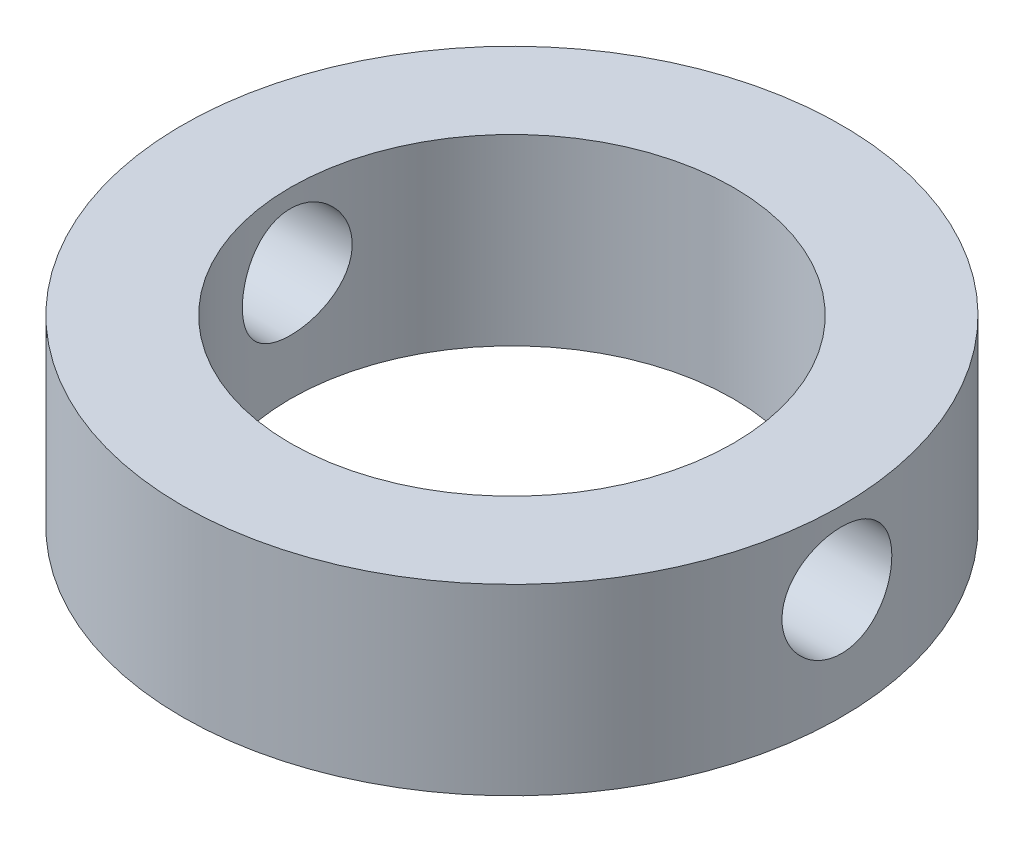
ISO-10303-21;
HEADER;
FILE_DESCRIPTION(('STEP AP214'),'2;1');
FILE_NAME('part.step','',(''),(''),'','','');
FILE_SCHEMA(('AUTOMOTIVE_DESIGN { 1 0 10303 214 1 1 1 1 }'));
ENDSEC;
DATA;
#1=APPLICATION_CONTEXT('core data for automotive mechanical design processes');
#2=APPLICATION_PROTOCOL_DEFINITION('international standard','automotive_design',2000,#1);
#3=PRODUCT_CONTEXT('',#1,'mechanical');
#4=PRODUCT('Part','Part','',(#3));
#5=PRODUCT_RELATED_PRODUCT_CATEGORY('part','',(#4));
#6=PRODUCT_DEFINITION_FORMATION('','',#4);
#7=PRODUCT_DEFINITION_CONTEXT('part definition',#1,'design');
#8=PRODUCT_DEFINITION('design','',#6,#7);
#9=PRODUCT_DEFINITION_SHAPE('','',#8);
#10=(LENGTH_UNIT() NAMED_UNIT(*) SI_UNIT(.MILLI.,.METRE.));
#11=(NAMED_UNIT(*) PLANE_ANGLE_UNIT() SI_UNIT($,.RADIAN.));
#12=(NAMED_UNIT(*) SI_UNIT($,.STERADIAN.) SOLID_ANGLE_UNIT());
#13=UNCERTAINTY_MEASURE_WITH_UNIT(LENGTH_MEASURE(1.E-05),#10,'distance_accuracy_value','');
#14=(GEOMETRIC_REPRESENTATION_CONTEXT(3) GLOBAL_UNCERTAINTY_ASSIGNED_CONTEXT((#13)) GLOBAL_UNIT_ASSIGNED_CONTEXT((#10,
#11,#12)) REPRESENTATION_CONTEXT('',''));
#15=CARTESIAN_POINT('',(0.,0.,0.));
#16=DIRECTION('',(0.,0.,1.));
#17=DIRECTION('',(1.,0.,0.));
#18=AXIS2_PLACEMENT_3D('',#15,#16,#17);
#19=CARTESIAN_POINT('',(-19.0091828831705,210.,-53.2448828787845));
#20=DIRECTION('',(0.,1.,0.));
#21=DIRECTION('',(0.,0.,-1.));
#22=AXIS2_PLACEMENT_3D('',#19,#20,#21);
#23=CYLINDRICAL_SURFACE('',#22,9.);
#24=CARTESIAN_POINT('',(-19.0091828831705,210.,-53.2448828787845));
#25=DIRECTION('',(0.,1.,0.));
#26=DIRECTION('',(0.,0.,1.));
#27=AXIS2_PLACEMENT_3D('',#24,#25,#26);
#28=CIRCLE('',#27,9.);
#29=CARTESIAN_POINT('',(-19.0091828831705,210.,-44.2448828787845));
#30=VERTEX_POINT('',#29);
#31=EDGE_CURVE('E10',#30,#30,#28,.T.);
#32=ORIENTED_EDGE('',*,*,#31,.T.);
#33=EDGE_LOOP('',(#32));
#34=FACE_BOUND('',#33,.T.);
#35=CARTESIAN_POINT('',(-19.0091828831705,215.,-53.2448828787845));
#36=DIRECTION('',(0.,1.,0.));
#37=DIRECTION('',(0.,0.,1.));
#38=AXIS2_PLACEMENT_3D('',#35,#36,#37);
#39=CIRCLE('',#38,9.);
#40=CARTESIAN_POINT('',(-19.0091828831705,215.,-44.2448828787845));
#41=VERTEX_POINT('',#40);
#42=EDGE_CURVE('E55',#41,#41,#39,.T.);
#43=ORIENTED_EDGE('',*,*,#42,.F.);
#44=EDGE_LOOP('',(#43));
#45=FACE_BOUND('',#44,.T.);
#46=CARTESIAN_POINT('',(-27.88330255782,213.,-51.7448828787845));
#47=CARTESIAN_POINT('',(-27.8833040675782,212.916374551112,-51.7448862397319));
#48=CARTESIAN_POINT('',(-27.8844974384589,212.832703436385,-51.7518997773621));
#49=CARTESIAN_POINT('',(-27.8891376273796,212.667708874068,-51.7797564219392));
#50=CARTESIAN_POINT('',(-27.8925865235191,212.58638766375,-51.8006122825987));
#51=CARTESIAN_POINT('',(-27.9013365391045,212.428504629986,-51.8555051525842));
#52=CARTESIAN_POINT('',(-27.9066361102022,212.3519388908,-51.8895311458258));
#53=CARTESIAN_POINT('',(-27.9184885158566,212.205611427172,-51.9697709806502));
#54=CARTESIAN_POINT('',(-27.9250412093554,212.135848938254,-52.0159834506835));
#55=CARTESIAN_POINT('',(-27.9387337100862,212.004412290153,-52.1197703626047));
#56=CARTESIAN_POINT('',(-27.9458781871329,211.942814921168,-52.1774414494251));
#57=CARTESIAN_POINT('',(-27.9599077671873,211.830124015883,-52.3022996759673));
#58=CARTESIAN_POINT('',(-27.9667928548024,211.779031102131,-52.3694873792945));
#59=CARTESIAN_POINT('',(-27.9795773050654,211.688511259668,-52.5119691568155));
#60=CARTESIAN_POINT('',(-27.9854705377642,211.649155795361,-52.5873092299105));
#61=CARTESIAN_POINT('',(-27.9955553049135,211.583687357682,-52.7436455057502));
#62=CARTESIAN_POINT('',(-27.9997469500066,211.557573523269,-52.8246413403376));
#63=CARTESIAN_POINT('',(-28.0059232915168,211.51956447901,-52.9891966429779));
#64=CARTESIAN_POINT('',(-28.007928001836,211.507540250397,-53.0727255467769));
#65=CARTESIAN_POINT('',(-28.0095733592272,211.497650547508,-53.240637707469));
#66=CARTESIAN_POINT('',(-28.0092141669864,211.499784110852,-53.3250209059018));
#67=CARTESIAN_POINT('',(-28.0061880337589,211.518048810917,-53.4913641898318));
#68=CARTESIAN_POINT('',(-28.0035439853249,211.534041098045,-53.5733399972046));
#69=CARTESIAN_POINT('',(-27.9962707558004,211.579350644548,-53.7334280665515));
#70=CARTESIAN_POINT('',(-27.9916415142498,211.608668309754,-53.8115402107754));
#71=CARTESIAN_POINT('',(-27.9808790742423,211.679934384189,-53.962096567454));
#72=CARTESIAN_POINT('',(-27.9747390871318,211.721940007249,-54.0345131925959));
#73=CARTESIAN_POINT('',(-27.9616373115995,211.817347693581,-54.1713221966924));
#74=CARTESIAN_POINT('',(-27.9546754566853,211.870750679226,-54.235713925534));
#75=CARTESIAN_POINT('',(-27.9406044925661,211.988207283972,-54.3554656428525));
#76=CARTESIAN_POINT('',(-27.9334946215568,212.052382256941,-54.4107065801364));
#77=CARTESIAN_POINT('',(-27.9200106418794,212.189152254129,-54.5096556318533));
#78=CARTESIAN_POINT('',(-27.9136365399985,212.26174735601,-54.5533636399039));
#79=CARTESIAN_POINT('',(-27.9023454105414,212.413434985126,-54.6280295394775));
#80=CARTESIAN_POINT('',(-27.8974300229861,212.492534698855,-54.658973095152));
#81=CARTESIAN_POINT('',(-27.8896400153098,212.654909443385,-54.7071008012738));
#82=CARTESIAN_POINT('',(-27.8867652155005,212.738184105859,-54.7242861632452));
#83=CARTESIAN_POINT('',(-27.8834166397032,212.905479693697,-54.744242009712));
#84=CARTESIAN_POINT('',(-27.8829145977225,212.989479827821,-54.7471822035319));
#85=CARTESIAN_POINT('',(-27.8842930918647,213.156772003015,-54.739016500394));
#86=CARTESIAN_POINT('',(-27.8861735359617,213.240064071308,-54.7279111459593));
#87=CARTESIAN_POINT('',(-27.8920790079006,213.403036655514,-54.6921142797413));
#88=CARTESIAN_POINT('',(-27.8960903946806,213.482736683927,-54.6675091531723));
#89=CARTESIAN_POINT('',(-27.9057943212035,213.636882099768,-54.6055017928998));
#90=CARTESIAN_POINT('',(-27.911486961514,213.711327172531,-54.568098793645));
#91=CARTESIAN_POINT('',(-27.9239776535549,213.853604756644,-54.481156882722));
#92=CARTESIAN_POINT('',(-27.9307854167726,213.921369943654,-54.4315092172801));
#93=CARTESIAN_POINT('',(-27.9447108832497,214.047668119617,-54.3216365582093));
#94=CARTESIAN_POINT('',(-27.9518286082825,214.106200458666,-54.2614108206149));
#95=CARTESIAN_POINT('',(-27.9656614158801,214.212991135637,-54.1313397209818));
#96=CARTESIAN_POINT('',(-27.9723715412386,214.261136295771,-54.0614008308162));
#97=CARTESIAN_POINT('',(-27.9845535577682,214.344993196203,-53.9143289475541));
#98=CARTESIAN_POINT('',(-27.9900254889904,214.380705338684,-53.8371961872669));
#99=CARTESIAN_POINT('',(-27.999093032188,214.438506350373,-53.6782623096853));
#100=CARTESIAN_POINT('',(-28.0026967905763,214.460654445441,-53.5964832163461));
#101=CARTESIAN_POINT('',(-28.0076563821862,214.490889359378,-53.430301319709));
#102=CARTESIAN_POINT('',(-28.0090124003716,214.498977335239,-53.3458987328775));
#103=CARTESIAN_POINT('',(-28.0093211104975,214.500829129387,-53.1779581133203));
#104=CARTESIAN_POINT('',(-28.008302695316,214.494765152365,-53.0944219824229));
#105=CARTESIAN_POINT('',(-28.0040359534942,214.468857646638,-52.9295756941957));
#106=CARTESIAN_POINT('',(-28.0007876393405,214.449014195094,-52.848265524404));
#107=CARTESIAN_POINT('',(-27.992424816136,214.396177100674,-52.6902450112333));
#108=CARTESIAN_POINT('',(-27.9873123854199,214.363198099074,-52.6135296554921));
#109=CARTESIAN_POINT('',(-27.9757794244346,214.285045238262,-52.4666946069953));
#110=CARTESIAN_POINT('',(-27.9693588321598,214.239870800963,-52.396575227114));
#111=CARTESIAN_POINT('',(-27.9558286608844,214.137998944523,-52.2640551114682));
#112=CARTESIAN_POINT('',(-27.9487120304749,214.081175427146,-52.2017520204211));
#113=CARTESIAN_POINT('',(-27.934640702999,213.957883015261,-52.0875045532157));
#114=CARTESIAN_POINT('',(-27.9276860442522,213.891411864665,-52.0355626067638));
#115=CARTESIAN_POINT('',(-27.9146729445911,213.750152806495,-51.9431743162327));
#116=CARTESIAN_POINT('',(-27.9086211910579,213.675309396097,-51.9028118853277));
#117=CARTESIAN_POINT('',(-27.8981781445011,213.519834458453,-51.8352941569199));
#118=CARTESIAN_POINT('',(-27.8937851936782,213.439208806382,-51.8081256656455));
#119=CARTESIAN_POINT('',(-27.8881313521972,213.298557738314,-51.7736672469112));
#120=CARTESIAN_POINT('',(-27.8863306236966,213.239383915225,-51.7628904281823));
#121=CARTESIAN_POINT('',(-27.8839156948897,213.120147909095,-51.748497101675));
#122=CARTESIAN_POINT('',(-27.8833014730432,213.060085742202,-51.7448804639093));
#123=CARTESIAN_POINT('',(-27.88330255782,213.,-51.7448828787845));
#124=B_SPLINE_CURVE_WITH_KNOTS('',3,(#46,#47,#48,#49,#50,#51,#52,#53,#54,#55,#56,#57,#58,#59,
#60,#61,#62,#63,#64,#65,#66,#67,#68,#69,#70,#71,#72,#73,#74,#75,#76,#77,#78,#79,#80,#81,#82,#83,
#84,#85,#86,#87,#88,#89,#90,#91,#92,#93,#94,#95,#96,#97,#98,#99,#100,#101,#102,#103,#104,#105,
#106,#107,#108,#109,#110,#111,#112,#113,#114,#115,#116,#117,#118,#119,#120,#121,#122,#123),
.UNSPECIFIED.,.T.,.F.,(4,2,2,2,2,2,2,2,2,2,2,2,2,2,2,2,2,2,2,2,2,2,2,2,2,2,2,2,2,2,2,2,2,2,2,2,
2,2,4),(0.,0.250656623343164,0.501544511951658,0.752222998698981,1.00287328440552,
1.25573495490816,1.50861160698055,1.76299788064249,2.01736761064056,2.26938940480927,
2.52139406789003,2.7709027269619,3.02041898547107,3.2710776248104,3.52175655733445,
3.77547674074661,4.02919926445001,4.28320597496551,4.53719031560234,4.78814125449636,
5.03908250045774,5.28843638778683,5.53780519373534,5.78947405655008,6.04116062655803,
6.29546467818616,6.54976050283404,6.80293790647973,7.05609447544798,7.30618665756937,
7.55627743928683,7.80609023896861,8.05591488232788,8.30860198475339,8.56134827326476,
8.81588236567713,9.07016140042578,9.25026402322166,9.43036337636995),.UNSPECIFIED.);
#125=CARTESIAN_POINT('',(-27.88330255782,213.,-51.7448828787845));
#126=VERTEX_POINT('',#125);
#127=EDGE_CURVE('E97',#126,#126,#124,.T.);
#128=ORIENTED_EDGE('',*,*,#127,.T.);
#129=EDGE_LOOP('',(#128));
#130=FACE_BOUND('',#129,.T.);
#131=CARTESIAN_POINT('',(-10.1350632085211,213.,-51.7448828787845));
#132=CARTESIAN_POINT('',(-10.1350616987629,213.083625448888,-51.7448862397319));
#133=CARTESIAN_POINT('',(-10.1338683278821,213.167296563615,-51.7518997773621));
#134=CARTESIAN_POINT('',(-10.1292281389615,213.332291125932,-51.7797564219392));
#135=CARTESIAN_POINT('',(-10.125779242822,213.41361233625,-51.8006122825987));
#136=CARTESIAN_POINT('',(-10.1170292272366,213.571495370014,-51.8555051525842));
#137=CARTESIAN_POINT('',(-10.1117296561388,213.6480611092,-51.8895311458258));
#138=CARTESIAN_POINT('',(-10.0998772504845,213.794388572828,-51.9697709806502));
#139=CARTESIAN_POINT('',(-10.0933245569857,213.864151061746,-52.0159834506835));
#140=CARTESIAN_POINT('',(-10.0796320562549,213.995587709847,-52.1197703626047));
#141=CARTESIAN_POINT('',(-10.0724875792081,214.057185078832,-52.1774414494251));
#142=CARTESIAN_POINT('',(-10.0584579991538,214.169875984117,-52.3022996759673));
#143=CARTESIAN_POINT('',(-10.0515729115387,214.220968897869,-52.3694873792945));
#144=CARTESIAN_POINT('',(-10.0387884612757,214.311488740332,-52.5119691568155));
#145=CARTESIAN_POINT('',(-10.0328952285769,214.350844204639,-52.5873092299105));
#146=CARTESIAN_POINT('',(-10.0228104614276,214.416312642318,-52.7436455057502));
#147=CARTESIAN_POINT('',(-10.0186188163345,214.442426476731,-52.8246413403376));
#148=CARTESIAN_POINT('',(-10.0124424748243,214.48043552099,-52.9891966429779));
#149=CARTESIAN_POINT('',(-10.0104377645051,214.492459749603,-53.0727255467769));
#150=CARTESIAN_POINT('',(-10.0087924071138,214.502349452492,-53.240637707469));
#151=CARTESIAN_POINT('',(-10.0091515993547,214.500215889148,-53.3250209059018));
#152=CARTESIAN_POINT('',(-10.0121777325822,214.481951189083,-53.4913641898318));
#153=CARTESIAN_POINT('',(-10.0148217810161,214.465958901955,-53.5733399972046));
#154=CARTESIAN_POINT('',(-10.0220950105407,214.420649355452,-53.7334280665515));
#155=CARTESIAN_POINT('',(-10.0267242520913,214.391331690246,-53.8115402107754));
#156=CARTESIAN_POINT('',(-10.0374866920988,214.320065615811,-53.962096567454));
#157=CARTESIAN_POINT('',(-10.0436266792093,214.278059992751,-54.0345131925959));
#158=CARTESIAN_POINT('',(-10.0567284547415,214.182652306419,-54.1713221966924));
#159=CARTESIAN_POINT('',(-10.0636903096557,214.129249320774,-54.235713925534));
#160=CARTESIAN_POINT('',(-10.077761273775,214.011792716028,-54.3554656428525));
#161=CARTESIAN_POINT('',(-10.0848711447843,213.947617743059,-54.4107065801364));
#162=CARTESIAN_POINT('',(-10.0983551244617,213.81084774587,-54.5096556318533));
#163=CARTESIAN_POINT('',(-10.1047292263426,213.73825264399,-54.5533636399039));
#164=CARTESIAN_POINT('',(-10.1160203557996,213.586565014873,-54.6280295394775));
#165=CARTESIAN_POINT('',(-10.1209357433549,213.507465301145,-54.658973095152));
#166=CARTESIAN_POINT('',(-10.1287257510313,213.345090556615,-54.7071008012738));
#167=CARTESIAN_POINT('',(-10.1316005508406,213.261815894141,-54.7242861632452));
#168=CARTESIAN_POINT('',(-10.1349491266378,213.094520306303,-54.744242009712));
#169=CARTESIAN_POINT('',(-10.1354511686185,213.010520172179,-54.7471822035319));
#170=CARTESIAN_POINT('',(-10.1340726744764,212.843227996986,-54.739016500394));
#171=CARTESIAN_POINT('',(-10.1321922303794,212.759935928692,-54.7279111459593));
#172=CARTESIAN_POINT('',(-10.1262867584404,212.596963344485,-54.6921142797413));
#173=CARTESIAN_POINT('',(-10.1222753716604,212.517263316073,-54.6675091531723));
#174=CARTESIAN_POINT('',(-10.1125714451375,212.363117900232,-54.6055017928998));
#175=CARTESIAN_POINT('',(-10.1068788048271,212.288672827469,-54.568098793645));
#176=CARTESIAN_POINT('',(-10.0943881127862,212.146395243356,-54.481156882722));
#177=CARTESIAN_POINT('',(-10.0875803495684,212.078630056346,-54.4315092172801));
#178=CARTESIAN_POINT('',(-10.0736548830913,211.952331880383,-54.3216365582093));
#179=CARTESIAN_POINT('',(-10.0665371580585,211.893799541334,-54.2614108206149));
#180=CARTESIAN_POINT('',(-10.0527043504609,211.787008864363,-54.1313397209818));
#181=CARTESIAN_POINT('',(-10.0459942251025,211.738863704229,-54.0614008308162));
#182=CARTESIAN_POINT('',(-10.0338122085729,211.655006803797,-53.9143289475541));
#183=CARTESIAN_POINT('',(-10.0283402773507,211.619294661316,-53.8371961872668));
#184=CARTESIAN_POINT('',(-10.019272734153,211.561493649627,-53.6782623096853));
#185=CARTESIAN_POINT('',(-10.0156689757648,211.539345554559,-53.596483216346));
#186=CARTESIAN_POINT('',(-10.0107093841548,211.509110640622,-53.430301319709));
#187=CARTESIAN_POINT('',(-10.0093533659695,211.501022664761,-53.3458987328775));
#188=CARTESIAN_POINT('',(-10.0090446558436,211.499170870613,-53.1779581133203));
#189=CARTESIAN_POINT('',(-10.0100630710251,211.505234847635,-53.0944219824229));
#190=CARTESIAN_POINT('',(-10.0143298128468,211.531142353362,-52.9295756941957));
#191=CARTESIAN_POINT('',(-10.0175781270005,211.550985804906,-52.848265524404));
#192=CARTESIAN_POINT('',(-10.025940950205,211.603822899326,-52.6902450112333));
#193=CARTESIAN_POINT('',(-10.0310533809212,211.636801900926,-52.6135296554921));
#194=CARTESIAN_POINT('',(-10.0425863419064,211.714954761738,-52.4666946069953));
#195=CARTESIAN_POINT('',(-10.0490069341812,211.760129199037,-52.396575227114));
#196=CARTESIAN_POINT('',(-10.0625371054567,211.862001055477,-52.2640551114682));
#197=CARTESIAN_POINT('',(-10.0696537358661,211.918824572854,-52.2017520204211));
#198=CARTESIAN_POINT('',(-10.083725063342,212.042116984739,-52.0875045532157));
#199=CARTESIAN_POINT('',(-10.0906797220889,212.108588135335,-52.0355626067638));
#200=CARTESIAN_POINT('',(-10.1036928217499,212.249847193505,-51.9431743162327));
#201=CARTESIAN_POINT('',(-10.1097445752831,212.324690603903,-51.9028118853277));
#202=CARTESIAN_POINT('',(-10.1201876218399,212.480165541547,-51.8352941569199));
#203=CARTESIAN_POINT('',(-10.1245805726629,212.560791193618,-51.8081256656455));
#204=CARTESIAN_POINT('',(-10.1302344141439,212.701442261686,-51.7736672469112));
#205=CARTESIAN_POINT('',(-10.1320351426444,212.760616084775,-51.7628904281823));
#206=CARTESIAN_POINT('',(-10.1344500714514,212.879852090905,-51.748497101675));
#207=CARTESIAN_POINT('',(-10.1350642932979,212.939914257798,-51.7448804639093));
#208=CARTESIAN_POINT('',(-10.1350632085211,213.,-51.7448828787845));
#209=B_SPLINE_CURVE_WITH_KNOTS('',3,(#131,#132,#133,#134,#135,#136,#137,#138,#139,#140,#141,
#142,#143,#144,#145,#146,#147,#148,#149,#150,#151,#152,#153,#154,#155,#156,#157,#158,#159,#160,
#161,#162,#163,#164,#165,#166,#167,#168,#169,#170,#171,#172,#173,#174,#175,#176,#177,#178,#179,
#180,#181,#182,#183,#184,#185,#186,#187,#188,#189,#190,#191,#192,#193,#194,#195,#196,#197,#198,
#199,#200,#201,#202,#203,#204,#205,#206,#207,#208),.UNSPECIFIED.,.T.,.F.,(4,2,2,2,2,2,2,2,2,2,2,
2,2,2,2,2,2,2,2,2,2,2,2,2,2,2,2,2,2,2,2,2,2,2,2,2,2,2,4),(0.,0.250656623343164,
0.501544511951658,0.752222998698981,1.00287328440552,1.25573495490816,1.50861160698055,
1.76299788064249,2.01736761064056,2.26938940480927,2.52139406789003,2.77090272696189,
3.02041898547107,3.2710776248104,3.52175655733445,3.77547674074661,4.02919926445001,
4.28320597496551,4.53719031560234,4.78814125449633,5.03908250045774,5.28843638778683,
5.53780519373534,5.78947405655009,6.04116062655803,6.29546467818618,6.54976050283409,
6.80293790647977,7.05609447544798,7.30618665756938,7.55627743928682,7.80609023896861,
8.05591488232788,8.30860198475339,8.56134827326476,8.81588236567716,9.07016140042578,
9.25026402322163,9.43036337636995),.UNSPECIFIED.);
#210=CARTESIAN_POINT('',(-10.1350632085211,213.,-51.7448828787845));
#211=VERTEX_POINT('',#210);
#212=EDGE_CURVE('E61',#211,#211,#209,.T.);
#213=ORIENTED_EDGE('',*,*,#212,.T.);
#214=EDGE_LOOP('',(#213));
#215=FACE_BOUND('',#214,.T.);
#216=ADVANCED_FACE('F39',(#34,#45,#130,#215),#23,.T.);
#217=CARTESIAN_POINT('',(-19.0091828831705,209.9,-53.2448828787845));
#218=DIRECTION('',(0.,1.,0.));
#219=DIRECTION('',(0.,0.,-1.));
#220=AXIS2_PLACEMENT_3D('',#217,#218,#219);
#221=CYLINDRICAL_SURFACE('',#220,6.05);
#222=CARTESIAN_POINT('',(-24.8702834624133,213.,-51.7448828787845));
#223=CARTESIAN_POINT('',(-24.8702850568459,212.917145871372,-51.7448852714866));
#224=CARTESIAN_POINT('',(-24.8720595174571,212.83426511614,-51.7517710666074));
#225=CARTESIAN_POINT('',(-24.8789478656689,212.670882052661,-51.7790893724568));
#226=CARTESIAN_POINT('',(-24.8840637292599,212.590381181258,-51.7995298990955));
#227=CARTESIAN_POINT('',(-24.8970206697318,212.434144766549,-51.8532567636231));
#228=CARTESIAN_POINT('',(-24.9048582645577,212.358403279826,-51.886526694153));
#229=CARTESIAN_POINT('',(-24.9223712447743,212.213569094319,-51.9649181769439));
#230=CARTESIAN_POINT('',(-24.9320467002792,212.144476649346,-52.0100401813859));
#231=CARTESIAN_POINT('',(-24.9523796561404,212.013406159432,-52.1118981320343));
#232=CARTESIAN_POINT('',(-24.9630526354277,211.951593249911,-52.168843525269));
#233=CARTESIAN_POINT('',(-24.9840437016995,211.838290682976,-52.2922805759095));
#234=CARTESIAN_POINT('',(-24.9943617558478,211.786801978596,-52.3587731136471));
#235=CARTESIAN_POINT('',(-25.0136514801466,211.694935328621,-52.500546607136));
#236=CARTESIAN_POINT('',(-25.0226027540224,211.654719373618,-52.5759355450226));
#237=CARTESIAN_POINT('',(-25.0379738821197,211.587592712703,-52.7326624126282));
#238=CARTESIAN_POINT('',(-25.0443941034728,211.560680076987,-52.8139994775348));
#239=CARTESIAN_POINT('',(-25.0538703190283,211.521452276688,-52.978592482665));
#240=CARTESIAN_POINT('',(-25.0569908413507,211.508856747212,-53.0617778237047));
#241=CARTESIAN_POINT('',(-25.0597408348001,211.497740893098,-53.2291354417412));
#242=CARTESIAN_POINT('',(-25.0593708139073,211.499218520387,-53.3133075733494));
#243=CARTESIAN_POINT('',(-25.0552295363811,211.516004889703,-53.478305767371));
#244=CARTESIAN_POINT('',(-25.0515326948305,211.531011035916,-53.5591647633216));
#245=CARTESIAN_POINT('',(-25.0412396704779,211.573942381363,-53.7171792065156));
#246=CARTESIAN_POINT('',(-25.0346433347749,211.601868261907,-53.7943344582088));
#247=CARTESIAN_POINT('',(-25.0191782452565,211.670092763352,-53.9435514464938));
#248=CARTESIAN_POINT('',(-25.0102897408778,211.710499557116,-54.015561593629));
#249=CARTESIAN_POINT('',(-24.9912052260717,211.802456929857,-54.1518854701365));
#250=CARTESIAN_POINT('',(-24.9810089916444,211.854009419009,-54.2161978773138));
#251=CARTESIAN_POINT('',(-24.9601004734071,211.968418739372,-54.3371050379952));
#252=CARTESIAN_POINT('',(-24.9493816778842,212.031540031227,-54.3934486825601));
#253=CARTESIAN_POINT('',(-24.9288849641037,212.166447544473,-54.4948064376446));
#254=CARTESIAN_POINT('',(-24.9191070883614,212.238234157074,-54.5398200363668));
#255=CARTESIAN_POINT('',(-24.9015763700652,212.388921008808,-54.6173971643501));
#256=CARTESIAN_POINT('',(-24.8938332649706,212.467853107807,-54.6499011607648));
#257=CARTESIAN_POINT('',(-24.8813742843728,212.630299513716,-54.7011005722889));
#258=CARTESIAN_POINT('',(-24.8766577731665,212.713812854385,-54.7197988872556));
#259=CARTESIAN_POINT('',(-24.8709191734455,212.88072474514,-54.7424414489509));
#260=CARTESIAN_POINT('',(-24.8698042388138,212.964069849902,-54.7467565794362));
#261=CARTESIAN_POINT('',(-24.8711424584858,213.130289310283,-54.7415248691219));
#262=CARTESIAN_POINT('',(-24.8735952903387,213.213163707763,-54.7319792810398));
#263=CARTESIAN_POINT('',(-24.8817037901151,213.374718130252,-54.6996220670496));
#264=CARTESIAN_POINT('',(-24.8873074853785,213.453444096,-54.6770255523593));
#265=CARTESIAN_POINT('',(-24.9010371444395,213.605990866611,-54.6194460252897));
#266=CARTESIAN_POINT('',(-24.9091634032059,213.679811096609,-54.5844615642934));
#267=CARTESIAN_POINT('',(-24.9272186395328,213.822024713169,-54.5023201124649));
#268=CARTESIAN_POINT('',(-24.9371794257557,213.89028562448,-54.4549409096159));
#269=CARTESIAN_POINT('',(-24.9577029518504,214.018024313333,-54.3496365426515));
#270=CARTESIAN_POINT('',(-24.9682657887546,214.077500669491,-54.2917096752495));
#271=CARTESIAN_POINT('',(-24.989117316607,214.187479914155,-54.1652538364561));
#272=CARTESIAN_POINT('',(-24.9993928998793,214.237726490308,-54.0964993870566));
#273=CARTESIAN_POINT('',(-25.0182432675438,214.325960338467,-53.9513131747291));
#274=CARTESIAN_POINT('',(-25.0268181402405,214.363948247033,-53.8748818107134));
#275=CARTESIAN_POINT('',(-25.0412471368977,214.426259322716,-53.7170373492165));
#276=CARTESIAN_POINT('',(-25.0471206544415,214.450680162875,-53.6356646657471));
#277=CARTESIAN_POINT('',(-25.055569989341,214.485458073156,-53.469805777597));
#278=CARTESIAN_POINT('',(-25.0581464319434,214.495817809803,-53.385320166369));
#279=CARTESIAN_POINT('',(-25.0596862845965,214.502031514408,-53.2180432793975));
#280=CARTESIAN_POINT('',(-25.0587439852062,214.498264033302,-53.1352667185128));
#281=CARTESIAN_POINT('',(-25.0535608306931,214.477195886485,-52.9715652774665));
#282=CARTESIAN_POINT('',(-25.0493200707326,214.459895611202,-52.890640343954));
#283=CARTESIAN_POINT('',(-25.0380305583394,214.412454589756,-52.7333283883995));
#284=CARTESIAN_POINT('',(-25.0309965652214,214.382381278526,-52.6569199016117));
#285=CARTESIAN_POINT('',(-25.0148619656469,214.310309234355,-52.5101902687428));
#286=CARTESIAN_POINT('',(-25.0057611024955,214.268309019989,-52.4398698802725));
#287=CARTESIAN_POINT('',(-24.9862062239836,214.172415313698,-52.3055139125641));
#288=CARTESIAN_POINT('',(-24.9757253218841,214.118264305729,-52.2416660406226));
#289=CARTESIAN_POINT('',(-24.9547141160229,214.000107510859,-52.1238349388713));
#290=CARTESIAN_POINT('',(-24.9441838004572,213.936099239464,-52.0698542035653));
#291=CARTESIAN_POINT('',(-24.9240473496045,213.798637306859,-51.9723226509854));
#292=CARTESIAN_POINT('',(-24.9144616117148,213.725032456485,-51.9289803847085));
#293=CARTESIAN_POINT('',(-24.8975727325172,213.571354258327,-51.855349825805));
#294=CARTESIAN_POINT('',(-24.8902679119987,213.491285724021,-51.8250519236661));
#295=CARTESIAN_POINT('',(-24.879924526445,213.34278419005,-51.7829446986912));
#296=CARTESIAN_POINT('',(-24.876336100783,213.275069134371,-51.768702355673));
#297=CARTESIAN_POINT('',(-24.8715150004875,213.138242154339,-51.7496708363202));
#298=CARTESIAN_POINT('',(-24.8702821320792,213.069130345359,-51.7448808824045));
#299=CARTESIAN_POINT('',(-24.8702834624133,213.,-51.7448828787845));
#300=B_SPLINE_CURVE_WITH_KNOTS('',3,(#222,#223,#224,#225,#226,#227,#228,#229,#230,#231,#232,
#233,#234,#235,#236,#237,#238,#239,#240,#241,#242,#243,#244,#245,#246,#247,#248,#249,#250,#251,
#252,#253,#254,#255,#256,#257,#258,#259,#260,#261,#262,#263,#264,#265,#266,#267,#268,#269,#270,
#271,#272,#273,#274,#275,#276,#277,#278,#279,#280,#281,#282,#283,#284,#285,#286,#287,#288,#289,
#290,#291,#292,#293,#294,#295,#296,#297,#298,#299),.UNSPECIFIED.,.T.,.F.,(4,2,2,2,2,2,2,2,2,2,2,
2,2,2,2,2,2,2,2,2,2,2,2,2,2,2,2,2,2,2,2,2,2,2,2,2,2,2,4),(0.,0.248308555378162,
0.496764084985487,0.744902916216997,0.993051215830481,1.24604175182047,1.49905563079246,
1.75553800799939,2.01198316847503,2.26331496642089,2.51461018850564,2.76042038788379,
3.0062435512986,3.2542600780021,3.5023191440844,3.75698358308596,4.01165952364873,
4.26753289950168,4.52335251433646,4.77252234046924,5.0216696482933,5.2668230552269,
5.51200513928916,5.7619263419736,6.01188793896212,6.26798960627748,6.52407797276705,
6.77829797232379,7.0324697552718,7.27988006564555,7.5272832383672,7.77339617740614,
8.01953969916323,8.27149784954299,8.52351960945304,8.78014536003374,9.03658173491865,
9.24377802972129,9.45095727924299),.UNSPECIFIED.);
#301=CARTESIAN_POINT('',(-24.8702834624133,213.,-51.7448828787845));
#302=VERTEX_POINT('',#301);
#303=EDGE_CURVE('E63',#302,#302,#300,.T.);
#304=ORIENTED_EDGE('',*,*,#303,.F.);
#305=EDGE_LOOP('',(#304));
#306=FACE_BOUND('',#305,.T.);
#307=CARTESIAN_POINT('',(-19.0091828831705,210.,-53.2448828787845));
#308=DIRECTION('',(0.,1.,0.));
#309=DIRECTION('',(0.,0.,1.));
#310=AXIS2_PLACEMENT_3D('',#307,#308,#309);
#311=CIRCLE('',#310,6.05);
#312=CARTESIAN_POINT('',(-19.0091828831705,210.,-47.1948828787845));
#313=VERTEX_POINT('',#312);
#314=EDGE_CURVE('E60',#313,#313,#311,.F.);
#315=ORIENTED_EDGE('',*,*,#314,.T.);
#316=EDGE_LOOP('',(#315));
#317=FACE_BOUND('',#316,.T.);
#318=CARTESIAN_POINT('',(-19.0091828831705,215.,-53.2448828787845));
#319=DIRECTION('',(0.,1.,0.));
#320=DIRECTION('',(0.,0.,1.));
#321=AXIS2_PLACEMENT_3D('',#318,#319,#320);
#322=CIRCLE('',#321,6.05);
#323=CARTESIAN_POINT('',(-19.0091828831705,215.,-47.1948828787845));
#324=VERTEX_POINT('',#323);
#325=EDGE_CURVE('E64',#324,#324,#322,.F.);
#326=ORIENTED_EDGE('',*,*,#325,.F.);
#327=EDGE_LOOP('',(#326));
#328=FACE_BOUND('',#327,.T.);
#329=CARTESIAN_POINT('',(-13.1480823039278,213.,-51.7448828787845));
#330=CARTESIAN_POINT('',(-13.1480807094952,213.082854128628,-51.7448852714866));
#331=CARTESIAN_POINT('',(-13.146306248884,213.16573488386,-51.7517710666074));
#332=CARTESIAN_POINT('',(-13.1394179006722,213.329117947339,-51.7790893724568));
#333=CARTESIAN_POINT('',(-13.1343020370812,213.409618818742,-51.7995298990955));
#334=CARTESIAN_POINT('',(-13.1213450966092,213.565855233451,-51.8532567636231));
#335=CARTESIAN_POINT('',(-13.1135075017833,213.641596720174,-51.886526694153));
#336=CARTESIAN_POINT('',(-13.0959945215668,213.786430905681,-51.9649181769439));
#337=CARTESIAN_POINT('',(-13.0863190660618,213.855523350654,-52.0100401813859));
#338=CARTESIAN_POINT('',(-13.0659861102007,213.986593840568,-52.1118981320343));
#339=CARTESIAN_POINT('',(-13.0553131309134,214.048406750089,-52.168843525269));
#340=CARTESIAN_POINT('',(-13.0343220646416,214.161709317024,-52.2922805759095));
#341=CARTESIAN_POINT('',(-13.0240040104932,214.213198021404,-52.3587731136471));
#342=CARTESIAN_POINT('',(-13.0047142861945,214.305064671379,-52.500546607136));
#343=CARTESIAN_POINT('',(-12.9957630123186,214.345280626382,-52.5759355450226));
#344=CARTESIAN_POINT('',(-12.9803918842214,214.412407287297,-52.7326624126282));
#345=CARTESIAN_POINT('',(-12.9739716628683,214.439319923013,-52.8139994775348));
#346=CARTESIAN_POINT('',(-12.9644954473128,214.478547723312,-52.978592482665));
#347=CARTESIAN_POINT('',(-12.9613749249903,214.491143252788,-53.0617778237047));
#348=CARTESIAN_POINT('',(-12.9586249315409,214.502259106902,-53.2291354417412));
#349=CARTESIAN_POINT('',(-12.9589949524337,214.500781479613,-53.3133075733494));
#350=CARTESIAN_POINT('',(-12.96313622996,214.483995110297,-53.478305767371));
#351=CARTESIAN_POINT('',(-12.9668330715105,214.468988964084,-53.5591647633216));
#352=CARTESIAN_POINT('',(-12.9771260958631,214.426057618637,-53.7171792065156));
#353=CARTESIAN_POINT('',(-12.9837224315662,214.398131738093,-53.7943344582088));
#354=CARTESIAN_POINT('',(-12.9991875210846,214.329907236648,-53.9435514464938));
#355=CARTESIAN_POINT('',(-13.0080760254632,214.289500442884,-54.015561593629));
#356=CARTESIAN_POINT('',(-13.0271605402694,214.197543070143,-54.1518854701365));
#357=CARTESIAN_POINT('',(-13.0373567746967,214.145990580991,-54.2161978773138));
#358=CARTESIAN_POINT('',(-13.058265292934,214.031581260628,-54.3371050379952));
#359=CARTESIAN_POINT('',(-13.0689840884569,213.968459968773,-54.3934486825601));
#360=CARTESIAN_POINT('',(-13.0894808022373,213.833552455527,-54.4948064376446));
#361=CARTESIAN_POINT('',(-13.0992586779796,213.761765842926,-54.5398200363668));
#362=CARTESIAN_POINT('',(-13.1167893962759,213.611078991192,-54.6173971643501));
#363=CARTESIAN_POINT('',(-13.1245325013705,213.532146892193,-54.6499011607648));
#364=CARTESIAN_POINT('',(-13.1369914819683,213.369700486284,-54.7011005722889));
#365=CARTESIAN_POINT('',(-13.1417079931746,213.286187145615,-54.7197988872556));
#366=CARTESIAN_POINT('',(-13.1474465928955,213.11927525486,-54.7424414489509));
#367=CARTESIAN_POINT('',(-13.1485615275273,213.035930150098,-54.7467565794362));
#368=CARTESIAN_POINT('',(-13.1472233078552,212.869710689717,-54.7415248691219));
#369=CARTESIAN_POINT('',(-13.1447704760023,212.786836292237,-54.7319792810398));
#370=CARTESIAN_POINT('',(-13.136661976226,212.625281869748,-54.6996220670496));
#371=CARTESIAN_POINT('',(-13.1310582809626,212.546555904,-54.6770255523593));
#372=CARTESIAN_POINT('',(-13.1173286219016,212.394009133389,-54.6194460252897));
#373=CARTESIAN_POINT('',(-13.1092023631352,212.320188903391,-54.5844615642934));
#374=CARTESIAN_POINT('',(-13.0911471268082,212.177975286831,-54.5023201124649));
#375=CARTESIAN_POINT('',(-13.0811863405854,212.10971437552,-54.4549409096159));
#376=CARTESIAN_POINT('',(-13.0606628144907,211.981975686667,-54.3496365426515));
#377=CARTESIAN_POINT('',(-13.0500999775865,211.922499330509,-54.2917096752495));
#378=CARTESIAN_POINT('',(-13.0292484497341,211.812520085845,-54.1652538364561));
#379=CARTESIAN_POINT('',(-13.0189728664618,211.762273509692,-54.0964993870566));
#380=CARTESIAN_POINT('',(-13.0001224987973,211.674039661533,-53.9513131747291));
#381=CARTESIAN_POINT('',(-12.9915476261006,211.636051752967,-53.8748818107134));
#382=CARTESIAN_POINT('',(-12.9771186294434,211.573740677284,-53.7170373492165));
#383=CARTESIAN_POINT('',(-12.9712451118996,211.549319837125,-53.6356646657471));
#384=CARTESIAN_POINT('',(-12.9627957770001,211.514541926844,-53.469805777597));
#385=CARTESIAN_POINT('',(-12.9602193343977,211.504182190197,-53.385320166369));
#386=CARTESIAN_POINT('',(-12.9586794817446,211.497968485592,-53.2180432793975));
#387=CARTESIAN_POINT('',(-12.9596217811348,211.501735966698,-53.1352667185128));
#388=CARTESIAN_POINT('',(-12.9648049356479,211.522804113515,-52.9715652774665));
#389=CARTESIAN_POINT('',(-12.9690456956084,211.540104388798,-52.890640343954));
#390=CARTESIAN_POINT('',(-12.9803352080017,211.587545410244,-52.7333283883994));
#391=CARTESIAN_POINT('',(-12.9873692011196,211.617618721474,-52.6569199016116));
#392=CARTESIAN_POINT('',(-13.0035038006941,211.689690765645,-52.5101902687428));
#393=CARTESIAN_POINT('',(-13.0126046638455,211.731690980011,-52.4398698802725));
#394=CARTESIAN_POINT('',(-13.0321595423575,211.827584686302,-52.305513912564));
#395=CARTESIAN_POINT('',(-13.0426404444569,211.881735694271,-52.2416660406225));
#396=CARTESIAN_POINT('',(-13.0636516503181,211.999892489141,-52.1238349388713));
#397=CARTESIAN_POINT('',(-13.0741819658838,212.063900760536,-52.0698542035653));
#398=CARTESIAN_POINT('',(-13.0943184167365,212.201362693141,-51.9723226509854));
#399=CARTESIAN_POINT('',(-13.1039041546263,212.274967543515,-51.9289803847085));
#400=CARTESIAN_POINT('',(-13.1207930338238,212.428645741673,-51.855349825805));
#401=CARTESIAN_POINT('',(-13.1280978543423,212.508714275979,-51.8250519236661));
#402=CARTESIAN_POINT('',(-13.138441239896,212.65721580995,-51.7829446986912));
#403=CARTESIAN_POINT('',(-13.142029665558,212.724930865629,-51.768702355673));
#404=CARTESIAN_POINT('',(-13.1468507658536,212.861757845661,-51.7496708363202));
#405=CARTESIAN_POINT('',(-13.1480836342619,212.930869654641,-51.7448808824045));
#406=CARTESIAN_POINT('',(-13.1480823039278,213.,-51.7448828787845));
#407=B_SPLINE_CURVE_WITH_KNOTS('',3,(#329,#330,#331,#332,#333,#334,#335,#336,#337,#338,#339,
#340,#341,#342,#343,#344,#345,#346,#347,#348,#349,#350,#351,#352,#353,#354,#355,#356,#357,#358,
#359,#360,#361,#362,#363,#364,#365,#366,#367,#368,#369,#370,#371,#372,#373,#374,#375,#376,#377,
#378,#379,#380,#381,#382,#383,#384,#385,#386,#387,#388,#389,#390,#391,#392,#393,#394,#395,#396,
#397,#398,#399,#400,#401,#402,#403,#404,#405,#406),.UNSPECIFIED.,.T.,.F.,(4,2,2,2,2,2,2,2,2,2,2,
2,2,2,2,2,2,2,2,2,2,2,2,2,2,2,2,2,2,2,2,2,2,2,2,2,2,2,4),(0.,0.248308555378162,
0.496764084985487,0.744902916216997,0.993051215830481,1.24604175182047,1.49905563079246,
1.75553800799939,2.01198316847503,2.26331496642089,2.51461018850564,2.76042038788379,
3.0062435512986,3.2542600780021,3.5023191440844,3.75698358308596,4.01165952364873,
4.26753289950165,4.52335251433646,4.77252234046924,5.0216696482933,5.2668230552269,
5.51200513928916,5.76192634197363,6.01188793896213,6.26798960627747,6.52407797276706,
6.77829797232379,7.0324697552718,7.27988006564556,7.52728323836721,7.77339617740616,
8.01953969916323,8.27149784954303,8.52351960945306,8.78014536003374,9.03658173491862,
9.24377802972127,9.45095727924299),.UNSPECIFIED.);
#408=CARTESIAN_POINT('',(-13.1480823039278,213.,-51.7448828787845));
#409=VERTEX_POINT('',#408);
#410=EDGE_CURVE('E43',#409,#409,#407,.T.);
#411=ORIENTED_EDGE('',*,*,#410,.F.);
#412=EDGE_LOOP('',(#411));
#413=FACE_BOUND('',#412,.T.);
#414=ADVANCED_FACE('F75',(#306,#317,#328,#413),#221,.F.);
#415=CARTESIAN_POINT('',(-19.0091828831705,210.,-53.2448828787845));
#416=DIRECTION('',(0.,-1.,0.));
#417=DIRECTION('',(0.,0.,1.));
#418=AXIS2_PLACEMENT_3D('',#415,#416,#417);
#419=PLANE('',#418);
#420=ORIENTED_EDGE('',*,*,#314,.F.);
#421=EDGE_LOOP('',(#420));
#422=FACE_BOUND('',#421,.T.);
#423=ORIENTED_EDGE('',*,*,#31,.F.);
#424=EDGE_LOOP('',(#423));
#425=FACE_BOUND('',#424,.T.);
#426=ADVANCED_FACE('F77',(#422,#425),#419,.T.);
#427=CARTESIAN_POINT('',(-19.0091828831705,215.,-53.2448828787845));
#428=DIRECTION('',(0.,-1.,0.));
#429=DIRECTION('',(0.,0.,1.));
#430=AXIS2_PLACEMENT_3D('',#427,#428,#429);
#431=PLANE('',#430);
#432=ORIENTED_EDGE('',*,*,#325,.T.);
#433=EDGE_LOOP('',(#432));
#434=FACE_BOUND('',#433,.T.);
#435=ORIENTED_EDGE('',*,*,#42,.T.);
#436=EDGE_LOOP('',(#435));
#437=FACE_BOUND('',#436,.T.);
#438=ADVANCED_FACE('F78',(#434,#437),#431,.F.);
#439=CARTESIAN_POINT('',(-9.00918288317053,213.,-53.2448828787845));
#440=DIRECTION('',(-1.,0.,0.));
#441=DIRECTION('',(0.,0.,1.));
#442=AXIS2_PLACEMENT_3D('',#439,#440,#441);
#443=CYLINDRICAL_SURFACE('',#442,1.5);
#444=ORIENTED_EDGE('',*,*,#303,.T.);
#445=EDGE_LOOP('',(#444));
#446=FACE_BOUND('',#445,.T.);
#447=ORIENTED_EDGE('',*,*,#127,.F.);
#448=EDGE_LOOP('',(#447));
#449=FACE_BOUND('',#448,.T.);
#450=ADVANCED_FACE('F84',(#446,#449),#443,.F.);
#451=ORIENTED_EDGE('',*,*,#410,.T.);
#452=EDGE_LOOP('',(#451));
#453=FACE_BOUND('',#452,.T.);
#454=ORIENTED_EDGE('',*,*,#212,.F.);
#455=EDGE_LOOP('',(#454));
#456=FACE_BOUND('',#455,.T.);
#457=ADVANCED_FACE('F70',(#453,#456),#443,.F.);
#458=CLOSED_SHELL('',(#216,#414,#426,#438,#450,#457));
#459=MANIFOLD_SOLID_BREP('B2',#458);
#460=ADVANCED_BREP_SHAPE_REPRESENTATION('',(#18,#459),#14);
#461=SHAPE_DEFINITION_REPRESENTATION(#9,#460);
ENDSEC;
END-ISO-10303-21;
